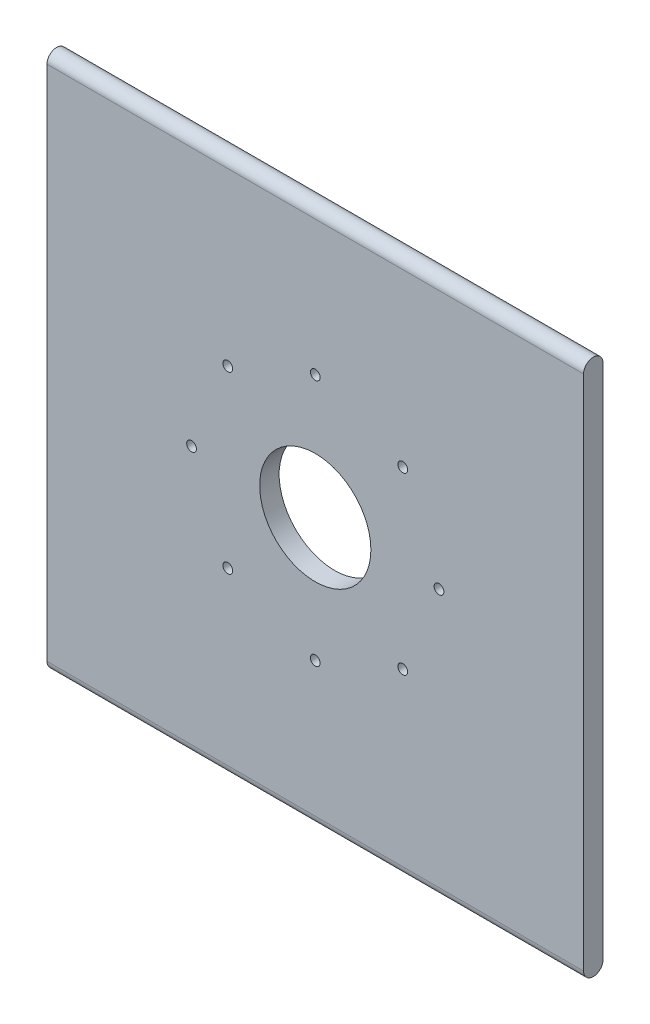
ISO-10303-21;
HEADER;
FILE_DESCRIPTION(('STEP AP214'),'2;1');
FILE_NAME('part.step','',(''),(''),'','','');
FILE_SCHEMA(('AUTOMOTIVE_DESIGN { 1 0 10303 214 1 1 1 1 }'));
ENDSEC;
DATA;
#1=APPLICATION_CONTEXT('core data for automotive mechanical design processes');
#2=APPLICATION_PROTOCOL_DEFINITION('international standard','automotive_design',2000,#1);
#3=PRODUCT_CONTEXT('',#1,'mechanical');
#4=PRODUCT('Part','Part','',(#3));
#5=PRODUCT_RELATED_PRODUCT_CATEGORY('part','',(#4));
#6=PRODUCT_DEFINITION_FORMATION('','',#4);
#7=PRODUCT_DEFINITION_CONTEXT('part definition',#1,'design');
#8=PRODUCT_DEFINITION('design','',#6,#7);
#9=PRODUCT_DEFINITION_SHAPE('','',#8);
#10=(LENGTH_UNIT() NAMED_UNIT(*) SI_UNIT(.MILLI.,.METRE.));
#11=(NAMED_UNIT(*) PLANE_ANGLE_UNIT() SI_UNIT($,.RADIAN.));
#12=(NAMED_UNIT(*) SI_UNIT($,.STERADIAN.) SOLID_ANGLE_UNIT());
#13=UNCERTAINTY_MEASURE_WITH_UNIT(LENGTH_MEASURE(1.E-05),#10,'distance_accuracy_value','');
#14=(GEOMETRIC_REPRESENTATION_CONTEXT(3) GLOBAL_UNCERTAINTY_ASSIGNED_CONTEXT((#13)) GLOBAL_UNIT_ASSIGNED_CONTEXT((#10,
#11,#12)) REPRESENTATION_CONTEXT('',''));
#15=CARTESIAN_POINT('',(0.,0.,0.));
#16=DIRECTION('',(0.,0.,1.));
#17=DIRECTION('',(1.,0.,0.));
#18=AXIS2_PLACEMENT_3D('',#15,#16,#17);
#19=CARTESIAN_POINT('',(96.5,-93.,3.5));
#20=DIRECTION('',(1.,0.,0.));
#21=DIRECTION('',(0.,0.,-1.));
#22=AXIS2_PLACEMENT_3D('',#19,#20,#21);
#23=CYLINDRICAL_SURFACE('',#22,3.5);
#24=DIRECTION('',(1.,0.,0.));
#25=VECTOR('',#24,1.);
#26=CARTESIAN_POINT('',(0.,-93.,0.));
#27=LINE('',#26,#25);
#28=CARTESIAN_POINT('',(96.5,-93.,0.));
#29=VERTEX_POINT('',#28);
#30=CARTESIAN_POINT('',(-96.5,-93.,0.));
#31=VERTEX_POINT('',#30);
#32=EDGE_CURVE('E97',#29,#31,#27,.F.);
#33=ORIENTED_EDGE('',*,*,#32,.F.);
#34=CARTESIAN_POINT('',(96.5,-93.,3.5));
#35=DIRECTION('',(-1.,0.,0.));
#36=DIRECTION('',(0.,-1.,0.));
#37=AXIS2_PLACEMENT_3D('',#34,#35,#36);
#38=CIRCLE('',#37,3.5);
#39=CARTESIAN_POINT('',(96.5,-93.,7.));
#40=VERTEX_POINT('',#39);
#41=EDGE_CURVE('E47',#40,#29,#38,.F.);
#42=ORIENTED_EDGE('',*,*,#41,.F.);
#43=DIRECTION('',(-1.,0.,0.));
#44=VECTOR('',#43,1.);
#45=CARTESIAN_POINT('',(96.5,-93.,7.));
#46=LINE('',#45,#44);
#47=CARTESIAN_POINT('',(-96.5,-93.,7.));
#48=VERTEX_POINT('',#47);
#49=EDGE_CURVE('E112',#48,#40,#46,.F.);
#50=ORIENTED_EDGE('',*,*,#49,.F.);
#51=CARTESIAN_POINT('',(-96.5,-93.,3.5));
#52=DIRECTION('',(1.,0.,0.));
#53=DIRECTION('',(0.,1.,0.));
#54=AXIS2_PLACEMENT_3D('',#51,#52,#53);
#55=CIRCLE('',#54,3.5);
#56=EDGE_CURVE('E11',#31,#48,#55,.F.);
#57=ORIENTED_EDGE('',*,*,#56,.F.);
#58=EDGE_LOOP('',(#33,#42,#50,#57));
#59=FACE_BOUND('',#58,.T.);
#60=ADVANCED_FACE('F39',(#59),#23,.T.);
#61=CARTESIAN_POINT('',(-96.5,93.,3.5));
#62=DIRECTION('',(-1.,0.,0.));
#63=DIRECTION('',(0.,0.,1.));
#64=AXIS2_PLACEMENT_3D('',#61,#62,#63);
#65=CYLINDRICAL_SURFACE('',#64,3.5);
#66=DIRECTION('',(-1.,0.,0.));
#67=VECTOR('',#66,1.);
#68=CARTESIAN_POINT('',(0.,93.,0.));
#69=LINE('',#68,#67);
#70=CARTESIAN_POINT('',(-96.5,93.,0.));
#71=VERTEX_POINT('',#70);
#72=CARTESIAN_POINT('',(96.5,93.,0.));
#73=VERTEX_POINT('',#72);
#74=EDGE_CURVE('E93',#71,#73,#69,.F.);
#75=ORIENTED_EDGE('',*,*,#74,.F.);
#76=CARTESIAN_POINT('',(-96.5,93.,3.5));
#77=DIRECTION('',(1.,0.,0.));
#78=DIRECTION('',(0.,1.,0.));
#79=AXIS2_PLACEMENT_3D('',#76,#77,#78);
#80=CIRCLE('',#79,3.5);
#81=CARTESIAN_POINT('',(-96.5,93.,7.));
#82=VERTEX_POINT('',#81);
#83=EDGE_CURVE('E98',#82,#71,#80,.F.);
#84=ORIENTED_EDGE('',*,*,#83,.F.);
#85=DIRECTION('',(1.,0.,0.));
#86=VECTOR('',#85,1.);
#87=CARTESIAN_POINT('',(-96.5,93.,7.));
#88=LINE('',#87,#86);
#89=CARTESIAN_POINT('',(96.5,93.,7.));
#90=VERTEX_POINT('',#89);
#91=EDGE_CURVE('E96',#90,#82,#88,.F.);
#92=ORIENTED_EDGE('',*,*,#91,.F.);
#93=CARTESIAN_POINT('',(96.5,93.,3.5));
#94=DIRECTION('',(-1.,0.,0.));
#95=DIRECTION('',(0.,-1.,0.));
#96=AXIS2_PLACEMENT_3D('',#93,#94,#95);
#97=CIRCLE('',#96,3.5);
#98=EDGE_CURVE('E82',#73,#90,#97,.F.);
#99=ORIENTED_EDGE('',*,*,#98,.F.);
#100=EDGE_LOOP('',(#75,#84,#92,#99));
#101=FACE_BOUND('',#100,.T.);
#102=ADVANCED_FACE('F92',(#101),#65,.T.);
#103=CARTESIAN_POINT('',(96.5,96.5,7.));
#104=DIRECTION('',(-1.,0.,0.));
#105=DIRECTION('',(0.,-1.,0.));
#106=AXIS2_PLACEMENT_3D('',#103,#104,#105);
#107=PLANE('',#106);
#108=DIRECTION('',(0.,1.,0.));
#109=VECTOR('',#108,1.);
#110=CARTESIAN_POINT('',(96.5,96.5,7.));
#111=LINE('',#110,#109);
#112=EDGE_CURVE('E105',#40,#90,#111,.T.);
#113=ORIENTED_EDGE('',*,*,#112,.F.);
#114=ORIENTED_EDGE('',*,*,#41,.T.);
#115=DIRECTION('',(0.,1.,0.));
#116=VECTOR('',#115,1.);
#117=CARTESIAN_POINT('',(96.5,96.5,0.));
#118=LINE('',#117,#116);
#119=EDGE_CURVE('E78',#29,#73,#118,.T.);
#120=ORIENTED_EDGE('',*,*,#119,.T.);
#121=ORIENTED_EDGE('',*,*,#98,.T.);
#122=EDGE_LOOP('',(#113,#114,#120,#121));
#123=FACE_BOUND('',#122,.T.);
#124=ADVANCED_FACE('F81',(#123),#107,.F.);
#125=CARTESIAN_POINT('',(-96.5,96.5,7.));
#126=DIRECTION('',(1.,0.,0.));
#127=DIRECTION('',(0.,1.,0.));
#128=AXIS2_PLACEMENT_3D('',#125,#126,#127);
#129=PLANE('',#128);
#130=DIRECTION('',(0.,-1.,0.));
#131=VECTOR('',#130,1.);
#132=CARTESIAN_POINT('',(-96.5,96.5,0.));
#133=LINE('',#132,#131);
#134=EDGE_CURVE('E87',#71,#31,#133,.T.);
#135=ORIENTED_EDGE('',*,*,#134,.T.);
#136=ORIENTED_EDGE('',*,*,#56,.T.);
#137=DIRECTION('',(0.,-1.,0.));
#138=VECTOR('',#137,1.);
#139=CARTESIAN_POINT('',(-96.5,96.5,7.));
#140=LINE('',#139,#138);
#141=EDGE_CURVE('E101',#82,#48,#140,.T.);
#142=ORIENTED_EDGE('',*,*,#141,.F.);
#143=ORIENTED_EDGE('',*,*,#83,.T.);
#144=EDGE_LOOP('',(#135,#136,#142,#143));
#145=FACE_BOUND('',#144,.T.);
#146=ADVANCED_FACE('F180',(#145),#129,.F.);
#147=CARTESIAN_POINT('',(0.,0.,7.));
#148=DIRECTION('',(0.,0.,1.));
#149=DIRECTION('',(1.,0.,0.));
#150=AXIS2_PLACEMENT_3D('',#147,#148,#149);
#151=PLANE('',#150);
#152=CARTESIAN_POINT('',(-3.10741839157039E-13,-44.5,7.));
#153=DIRECTION('',(0.,0.,1.));
#154=DIRECTION('',(1.,0.,0.));
#155=AXIS2_PLACEMENT_3D('',#152,#153,#154);
#156=CIRCLE('',#155,1.75);
#157=CARTESIAN_POINT('',(1.74999999999969,-44.5,7.));
#158=VERTEX_POINT('',#157);
#159=EDGE_CURVE('E163',#158,#158,#156,.T.);
#160=ORIENTED_EDGE('',*,*,#159,.F.);
#161=EDGE_LOOP('',(#160));
#162=FACE_BOUND('',#161,.T.);
#163=CARTESIAN_POINT('',(31.4662517628012,-31.4662517628015,7.));
#164=DIRECTION('',(0.,0.,1.));
#165=DIRECTION('',(1.,0.,0.));
#166=AXIS2_PLACEMENT_3D('',#163,#164,#165);
#167=CIRCLE('',#166,1.75);
#168=CARTESIAN_POINT('',(33.2162517628012,-31.4662517628015,7.));
#169=VERTEX_POINT('',#168);
#170=EDGE_CURVE('E160',#169,#169,#167,.T.);
#171=ORIENTED_EDGE('',*,*,#170,.F.);
#172=EDGE_LOOP('',(#171));
#173=FACE_BOUND('',#172,.T.);
#174=CARTESIAN_POINT('',(44.5,-1.55370919578519E-13,7.));
#175=DIRECTION('',(0.,0.,1.));
#176=DIRECTION('',(1.,0.,0.));
#177=AXIS2_PLACEMENT_3D('',#174,#175,#176);
#178=CIRCLE('',#177,1.75);
#179=CARTESIAN_POINT('',(46.25,-1.55370919578519E-13,7.));
#180=VERTEX_POINT('',#179);
#181=EDGE_CURVE('E154',#180,#180,#178,.T.);
#182=ORIENTED_EDGE('',*,*,#181,.F.);
#183=EDGE_LOOP('',(#182));
#184=FACE_BOUND('',#183,.T.);
#185=CARTESIAN_POINT('',(31.4662517628014,31.4662517628013,7.));
#186=DIRECTION('',(0.,0.,1.));
#187=DIRECTION('',(1.,0.,0.));
#188=AXIS2_PLACEMENT_3D('',#185,#186,#187);
#189=CIRCLE('',#188,1.75);
#190=CARTESIAN_POINT('',(33.2162517628014,31.4662517628013,7.));
#191=VERTEX_POINT('',#190);
#192=EDGE_CURVE('E148',#191,#191,#189,.T.);
#193=ORIENTED_EDGE('',*,*,#192,.F.);
#194=EDGE_LOOP('',(#193));
#195=FACE_BOUND('',#194,.T.);
#196=CARTESIAN_POINT('',(0.,44.5,7.));
#197=DIRECTION('',(0.,0.,1.));
#198=DIRECTION('',(1.,0.,0.));
#199=AXIS2_PLACEMENT_3D('',#196,#197,#198);
#200=CIRCLE('',#199,1.75);
#201=CARTESIAN_POINT('',(1.75,44.5,7.));
#202=VERTEX_POINT('',#201);
#203=EDGE_CURVE('E142',#202,#202,#200,.T.);
#204=ORIENTED_EDGE('',*,*,#203,.F.);
#205=EDGE_LOOP('',(#204));
#206=FACE_BOUND('',#205,.T.);
#207=CARTESIAN_POINT('',(-44.5,4.66112758735558E-13,7.));
#208=DIRECTION('',(0.,0.,1.));
#209=DIRECTION('',(1.,0.,0.));
#210=AXIS2_PLACEMENT_3D('',#207,#208,#209);
#211=CIRCLE('',#210,1.75);
#212=CARTESIAN_POINT('',(-42.75,4.66112758735558E-13,7.));
#213=VERTEX_POINT('',#212);
#214=EDGE_CURVE('E136',#213,#213,#211,.T.);
#215=ORIENTED_EDGE('',*,*,#214,.F.);
#216=EDGE_LOOP('',(#215));
#217=FACE_BOUND('',#216,.T.);
#218=CARTESIAN_POINT('',(-31.4662517628016,-31.4662517628011,7.));
#219=DIRECTION('',(0.,0.,1.));
#220=DIRECTION('',(1.,0.,0.));
#221=AXIS2_PLACEMENT_3D('',#218,#219,#220);
#222=CIRCLE('',#221,1.75);
#223=CARTESIAN_POINT('',(-29.7162517628016,-31.4662517628011,7.));
#224=VERTEX_POINT('',#223);
#225=EDGE_CURVE('E130',#224,#224,#222,.T.);
#226=ORIENTED_EDGE('',*,*,#225,.F.);
#227=EDGE_LOOP('',(#226));
#228=FACE_BOUND('',#227,.T.);
#229=CARTESIAN_POINT('',(-31.466251762801,31.4662517628018,7.));
#230=DIRECTION('',(0.,0.,1.));
#231=DIRECTION('',(1.,0.,0.));
#232=AXIS2_PLACEMENT_3D('',#229,#230,#231);
#233=CIRCLE('',#232,1.74999999999999);
#234=CARTESIAN_POINT('',(-29.716251762801,31.4662517628018,7.));
#235=VERTEX_POINT('',#234);
#236=EDGE_CURVE('E124',#235,#235,#233,.T.);
#237=ORIENTED_EDGE('',*,*,#236,.F.);
#238=EDGE_LOOP('',(#237));
#239=FACE_BOUND('',#238,.T.);
#240=CARTESIAN_POINT('',(0.,0.,7.));
#241=DIRECTION('',(0.,0.,1.));
#242=DIRECTION('',(1.,0.,0.));
#243=AXIS2_PLACEMENT_3D('',#240,#241,#242);
#244=CIRCLE('',#243,20.);
#245=CARTESIAN_POINT('',(20.,0.,7.));
#246=VERTEX_POINT('',#245);
#247=EDGE_CURVE('E117',#246,#246,#244,.T.);
#248=ORIENTED_EDGE('',*,*,#247,.F.);
#249=EDGE_LOOP('',(#248));
#250=FACE_BOUND('',#249,.T.);
#251=ORIENTED_EDGE('',*,*,#141,.T.);
#252=ORIENTED_EDGE('',*,*,#49,.T.);
#253=ORIENTED_EDGE('',*,*,#112,.T.);
#254=ORIENTED_EDGE('',*,*,#91,.T.);
#255=EDGE_LOOP('',(#251,#252,#253,#254));
#256=FACE_BOUND('',#255,.T.);
#257=ADVANCED_FACE('F114',(#162,#173,#184,#195,#206,#217,#228,#239,#250,#256),#151,.T.);
#258=CARTESIAN_POINT('',(0.,0.,0.));
#259=DIRECTION('',(0.,0.,1.));
#260=DIRECTION('',(1.,0.,0.));
#261=AXIS2_PLACEMENT_3D('',#258,#259,#260);
#262=PLANE('',#261);
#263=CARTESIAN_POINT('',(-3.10741839157039E-13,-44.5,0.));
#264=DIRECTION('',(0.,0.,1.));
#265=DIRECTION('',(1.,0.,0.));
#266=AXIS2_PLACEMENT_3D('',#263,#264,#265);
#267=CIRCLE('',#266,1.75);
#268=CARTESIAN_POINT('',(1.74999999999969,-44.5,0.));
#269=VERTEX_POINT('',#268);
#270=EDGE_CURVE('E120',#269,#269,#267,.T.);
#271=ORIENTED_EDGE('',*,*,#270,.T.);
#272=EDGE_LOOP('',(#271));
#273=FACE_BOUND('',#272,.T.);
#274=CARTESIAN_POINT('',(31.4662517628012,-31.4662517628015,0.));
#275=DIRECTION('',(0.,0.,1.));
#276=DIRECTION('',(1.,0.,0.));
#277=AXIS2_PLACEMENT_3D('',#274,#275,#276);
#278=CIRCLE('',#277,1.75);
#279=CARTESIAN_POINT('',(33.2162517628012,-31.4662517628015,0.));
#280=VERTEX_POINT('',#279);
#281=EDGE_CURVE('E157',#280,#280,#278,.T.);
#282=ORIENTED_EDGE('',*,*,#281,.T.);
#283=EDGE_LOOP('',(#282));
#284=FACE_BOUND('',#283,.T.);
#285=CARTESIAN_POINT('',(44.5,-1.55370919578519E-13,0.));
#286=DIRECTION('',(0.,0.,1.));
#287=DIRECTION('',(1.,0.,0.));
#288=AXIS2_PLACEMENT_3D('',#285,#286,#287);
#289=CIRCLE('',#288,1.75);
#290=CARTESIAN_POINT('',(46.25,-1.55370919578519E-13,0.));
#291=VERTEX_POINT('',#290);
#292=EDGE_CURVE('E151',#291,#291,#289,.T.);
#293=ORIENTED_EDGE('',*,*,#292,.T.);
#294=EDGE_LOOP('',(#293));
#295=FACE_BOUND('',#294,.T.);
#296=CARTESIAN_POINT('',(31.4662517628014,31.4662517628013,0.));
#297=DIRECTION('',(0.,0.,1.));
#298=DIRECTION('',(1.,0.,0.));
#299=AXIS2_PLACEMENT_3D('',#296,#297,#298);
#300=CIRCLE('',#299,1.75);
#301=CARTESIAN_POINT('',(33.2162517628014,31.4662517628013,0.));
#302=VERTEX_POINT('',#301);
#303=EDGE_CURVE('E145',#302,#302,#300,.T.);
#304=ORIENTED_EDGE('',*,*,#303,.T.);
#305=EDGE_LOOP('',(#304));
#306=FACE_BOUND('',#305,.T.);
#307=CARTESIAN_POINT('',(0.,44.5,0.));
#308=DIRECTION('',(0.,0.,1.));
#309=DIRECTION('',(1.,0.,0.));
#310=AXIS2_PLACEMENT_3D('',#307,#308,#309);
#311=CIRCLE('',#310,1.75);
#312=CARTESIAN_POINT('',(1.75,44.5,0.));
#313=VERTEX_POINT('',#312);
#314=EDGE_CURVE('E139',#313,#313,#311,.T.);
#315=ORIENTED_EDGE('',*,*,#314,.T.);
#316=EDGE_LOOP('',(#315));
#317=FACE_BOUND('',#316,.T.);
#318=CARTESIAN_POINT('',(-44.5,4.66112758735558E-13,0.));
#319=DIRECTION('',(0.,0.,1.));
#320=DIRECTION('',(1.,0.,0.));
#321=AXIS2_PLACEMENT_3D('',#318,#319,#320);
#322=CIRCLE('',#321,1.75);
#323=CARTESIAN_POINT('',(-42.75,4.66112758735558E-13,0.));
#324=VERTEX_POINT('',#323);
#325=EDGE_CURVE('E133',#324,#324,#322,.T.);
#326=ORIENTED_EDGE('',*,*,#325,.T.);
#327=EDGE_LOOP('',(#326));
#328=FACE_BOUND('',#327,.T.);
#329=CARTESIAN_POINT('',(-31.4662517628016,-31.4662517628011,0.));
#330=DIRECTION('',(0.,0.,1.));
#331=DIRECTION('',(1.,0.,0.));
#332=AXIS2_PLACEMENT_3D('',#329,#330,#331);
#333=CIRCLE('',#332,1.75);
#334=CARTESIAN_POINT('',(-29.7162517628016,-31.4662517628011,0.));
#335=VERTEX_POINT('',#334);
#336=EDGE_CURVE('E127',#335,#335,#333,.T.);
#337=ORIENTED_EDGE('',*,*,#336,.T.);
#338=EDGE_LOOP('',(#337));
#339=FACE_BOUND('',#338,.T.);
#340=CARTESIAN_POINT('',(-31.466251762801,31.4662517628018,0.));
#341=DIRECTION('',(0.,0.,1.));
#342=DIRECTION('',(1.,0.,0.));
#343=AXIS2_PLACEMENT_3D('',#340,#341,#342);
#344=CIRCLE('',#343,1.74999999999999);
#345=CARTESIAN_POINT('',(-29.716251762801,31.4662517628018,0.));
#346=VERTEX_POINT('',#345);
#347=EDGE_CURVE('E121',#346,#346,#344,.T.);
#348=ORIENTED_EDGE('',*,*,#347,.T.);
#349=EDGE_LOOP('',(#348));
#350=FACE_BOUND('',#349,.T.);
#351=CARTESIAN_POINT('',(0.,0.,0.));
#352=DIRECTION('',(0.,0.,1.));
#353=DIRECTION('',(1.,0.,0.));
#354=AXIS2_PLACEMENT_3D('',#351,#352,#353);
#355=CIRCLE('',#354,20.);
#356=CARTESIAN_POINT('',(20.,0.,0.));
#357=VERTEX_POINT('',#356);
#358=EDGE_CURVE('E88',#357,#357,#355,.T.);
#359=ORIENTED_EDGE('',*,*,#358,.T.);
#360=EDGE_LOOP('',(#359));
#361=FACE_BOUND('',#360,.T.);
#362=ORIENTED_EDGE('',*,*,#119,.F.);
#363=ORIENTED_EDGE('',*,*,#32,.T.);
#364=ORIENTED_EDGE('',*,*,#134,.F.);
#365=ORIENTED_EDGE('',*,*,#74,.T.);
#366=EDGE_LOOP('',(#362,#363,#364,#365));
#367=FACE_BOUND('',#366,.T.);
#368=ADVANCED_FACE('F100',(#273,#284,#295,#306,#317,#328,#339,#350,#361,#367),#262,.F.);
#369=CARTESIAN_POINT('',(0.,0.,-116.));
#370=DIRECTION('',(0.,0.,1.));
#371=DIRECTION('',(1.,0.,0.));
#372=AXIS2_PLACEMENT_3D('',#369,#370,#371);
#373=CYLINDRICAL_SURFACE('',#372,20.);
#374=ORIENTED_EDGE('',*,*,#247,.T.);
#375=EDGE_LOOP('',(#374));
#376=FACE_BOUND('',#375,.T.);
#377=ORIENTED_EDGE('',*,*,#358,.F.);
#378=EDGE_LOOP('',(#377));
#379=FACE_BOUND('',#378,.T.);
#380=ADVANCED_FACE('F198',(#376,#379),#373,.F.);
#381=CARTESIAN_POINT('',(-31.466251762801,31.4662517628018,0.));
#382=DIRECTION('',(0.,0.,1.));
#383=DIRECTION('',(1.,0.,0.));
#384=AXIS2_PLACEMENT_3D('',#381,#382,#383);
#385=CYLINDRICAL_SURFACE('',#384,1.74999999999999);
#386=ORIENTED_EDGE('',*,*,#347,.F.);
#387=EDGE_LOOP('',(#386));
#388=FACE_BOUND('',#387,.T.);
#389=ORIENTED_EDGE('',*,*,#236,.T.);
#390=EDGE_LOOP('',(#389));
#391=FACE_BOUND('',#390,.T.);
#392=ADVANCED_FACE('F201',(#388,#391),#385,.F.);
#393=CARTESIAN_POINT('',(-31.4662517628016,-31.4662517628011,0.));
#394=DIRECTION('',(0.,0.,1.));
#395=DIRECTION('',(1.,0.,0.));
#396=AXIS2_PLACEMENT_3D('',#393,#394,#395);
#397=CYLINDRICAL_SURFACE('',#396,1.75);
#398=ORIENTED_EDGE('',*,*,#336,.F.);
#399=EDGE_LOOP('',(#398));
#400=FACE_BOUND('',#399,.T.);
#401=ORIENTED_EDGE('',*,*,#225,.T.);
#402=EDGE_LOOP('',(#401));
#403=FACE_BOUND('',#402,.T.);
#404=ADVANCED_FACE('F295',(#400,#403),#397,.F.);
#405=CARTESIAN_POINT('',(-44.5,4.66112758735558E-13,0.));
#406=DIRECTION('',(0.,0.,1.));
#407=DIRECTION('',(1.,0.,0.));
#408=AXIS2_PLACEMENT_3D('',#405,#406,#407);
#409=CYLINDRICAL_SURFACE('',#408,1.75);
#410=ORIENTED_EDGE('',*,*,#325,.F.);
#411=EDGE_LOOP('',(#410));
#412=FACE_BOUND('',#411,.T.);
#413=ORIENTED_EDGE('',*,*,#214,.T.);
#414=EDGE_LOOP('',(#413));
#415=FACE_BOUND('',#414,.T.);
#416=ADVANCED_FACE('F284',(#412,#415),#409,.F.);
#417=CARTESIAN_POINT('',(0.,44.5,0.));
#418=DIRECTION('',(0.,0.,1.));
#419=DIRECTION('',(1.,0.,0.));
#420=AXIS2_PLACEMENT_3D('',#417,#418,#419);
#421=CYLINDRICAL_SURFACE('',#420,1.75);
#422=ORIENTED_EDGE('',*,*,#314,.F.);
#423=EDGE_LOOP('',(#422));
#424=FACE_BOUND('',#423,.T.);
#425=ORIENTED_EDGE('',*,*,#203,.T.);
#426=EDGE_LOOP('',(#425));
#427=FACE_BOUND('',#426,.T.);
#428=ADVANCED_FACE('F273',(#424,#427),#421,.F.);
#429=CARTESIAN_POINT('',(31.4662517628014,31.4662517628013,0.));
#430=DIRECTION('',(0.,0.,1.));
#431=DIRECTION('',(1.,0.,0.));
#432=AXIS2_PLACEMENT_3D('',#429,#430,#431);
#433=CYLINDRICAL_SURFACE('',#432,1.75);
#434=ORIENTED_EDGE('',*,*,#303,.F.);
#435=EDGE_LOOP('',(#434));
#436=FACE_BOUND('',#435,.T.);
#437=ORIENTED_EDGE('',*,*,#192,.T.);
#438=EDGE_LOOP('',(#437));
#439=FACE_BOUND('',#438,.T.);
#440=ADVANCED_FACE('F262',(#436,#439),#433,.F.);
#441=CARTESIAN_POINT('',(44.5,-1.55370919578519E-13,0.));
#442=DIRECTION('',(0.,0.,1.));
#443=DIRECTION('',(1.,0.,0.));
#444=AXIS2_PLACEMENT_3D('',#441,#442,#443);
#445=CYLINDRICAL_SURFACE('',#444,1.75);
#446=ORIENTED_EDGE('',*,*,#292,.F.);
#447=EDGE_LOOP('',(#446));
#448=FACE_BOUND('',#447,.T.);
#449=ORIENTED_EDGE('',*,*,#181,.T.);
#450=EDGE_LOOP('',(#449));
#451=FACE_BOUND('',#450,.T.);
#452=ADVANCED_FACE('F251',(#448,#451),#445,.F.);
#453=CARTESIAN_POINT('',(31.4662517628012,-31.4662517628015,0.));
#454=DIRECTION('',(0.,0.,1.));
#455=DIRECTION('',(1.,0.,0.));
#456=AXIS2_PLACEMENT_3D('',#453,#454,#455);
#457=CYLINDRICAL_SURFACE('',#456,1.75);
#458=ORIENTED_EDGE('',*,*,#281,.F.);
#459=EDGE_LOOP('',(#458));
#460=FACE_BOUND('',#459,.T.);
#461=ORIENTED_EDGE('',*,*,#170,.T.);
#462=EDGE_LOOP('',(#461));
#463=FACE_BOUND('',#462,.T.);
#464=ADVANCED_FACE('F174',(#460,#463),#457,.F.);
#465=CARTESIAN_POINT('',(-3.10741839157039E-13,-44.5,0.));
#466=DIRECTION('',(0.,0.,1.));
#467=DIRECTION('',(1.,0.,0.));
#468=AXIS2_PLACEMENT_3D('',#465,#466,#467);
#469=CYLINDRICAL_SURFACE('',#468,1.75);
#470=ORIENTED_EDGE('',*,*,#270,.F.);
#471=EDGE_LOOP('',(#470));
#472=FACE_BOUND('',#471,.T.);
#473=ORIENTED_EDGE('',*,*,#159,.T.);
#474=EDGE_LOOP('',(#473));
#475=FACE_BOUND('',#474,.T.);
#476=ADVANCED_FACE('F171',(#472,#475),#469,.F.);
#477=CLOSED_SHELL('',(#60,#102,#124,#146,#257,#368,#380,#392,#404,#416,#428,#440,#452,#464,#476));
#478=MANIFOLD_SOLID_BREP('B2',#477);
#479=ADVANCED_BREP_SHAPE_REPRESENTATION('',(#18,#478),#14);
#480=SHAPE_DEFINITION_REPRESENTATION(#9,#479);
ENDSEC;
END-ISO-10303-21;
